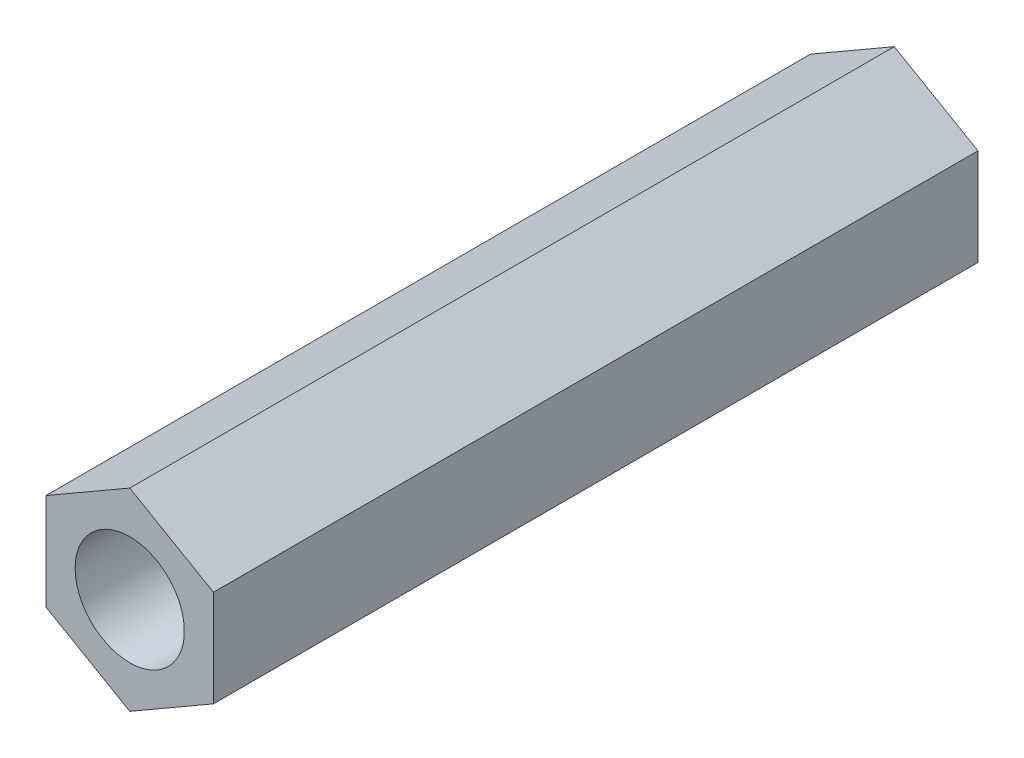
ISO-10303-21;
HEADER;
FILE_DESCRIPTION(('STEP AP214'),'2;1');
FILE_NAME('part.step','',(''),(''),'','','');
FILE_SCHEMA(('AUTOMOTIVE_DESIGN { 1 0 10303 214 1 1 1 1 }'));
ENDSEC;
DATA;
#1=APPLICATION_CONTEXT('core data for automotive mechanical design processes');
#2=APPLICATION_PROTOCOL_DEFINITION('international standard','automotive_design',2000,#1);
#3=PRODUCT_CONTEXT('',#1,'mechanical');
#4=PRODUCT('Part','Part','',(#3));
#5=PRODUCT_RELATED_PRODUCT_CATEGORY('part','',(#4));
#6=PRODUCT_DEFINITION_FORMATION('','',#4);
#7=PRODUCT_DEFINITION_CONTEXT('part definition',#1,'design');
#8=PRODUCT_DEFINITION('design','',#6,#7);
#9=PRODUCT_DEFINITION_SHAPE('','',#8);
#10=(LENGTH_UNIT() NAMED_UNIT(*) SI_UNIT(.MILLI.,.METRE.));
#11=(NAMED_UNIT(*) PLANE_ANGLE_UNIT() SI_UNIT($,.RADIAN.));
#12=(NAMED_UNIT(*) SI_UNIT($,.STERADIAN.) SOLID_ANGLE_UNIT());
#13=UNCERTAINTY_MEASURE_WITH_UNIT(LENGTH_MEASURE(1.E-05),#10,'distance_accuracy_value','');
#14=(GEOMETRIC_REPRESENTATION_CONTEXT(3) GLOBAL_UNCERTAINTY_ASSIGNED_CONTEXT((#13)) GLOBAL_UNIT_ASSIGNED_CONTEXT((#10,
#11,#12)) REPRESENTATION_CONTEXT('',''));
#15=CARTESIAN_POINT('',(0.,0.,0.));
#16=DIRECTION('',(0.,0.,1.));
#17=DIRECTION('',(1.,0.,0.));
#18=AXIS2_PLACEMENT_3D('',#15,#16,#17);
#19=CARTESIAN_POINT('',(0.,0.,21.));
#20=DIRECTION('',(0.,0.,1.));
#21=DIRECTION('',(1.,0.,0.));
#22=AXIS2_PLACEMENT_3D('',#19,#20,#21);
#23=PLANE('',#22);
#24=DIRECTION('',(0.866025403784438,0.5,0.));
#25=VECTOR('',#24,1.);
#26=CARTESIAN_POINT('',(0.,-2.65581123827228,21.));
#27=LINE('',#26,#25);
#28=CARTESIAN_POINT('',(0.,-2.65581123827228,21.));
#29=VERTEX_POINT('',#28);
#30=CARTESIAN_POINT('',(2.3,-1.32790561913614,21.));
#31=VERTEX_POINT('',#30);
#32=EDGE_CURVE('E140',#29,#31,#27,.T.);
#33=ORIENTED_EDGE('',*,*,#32,.T.);
#34=DIRECTION('',(0.,1.,0.));
#35=VECTOR('',#34,1.);
#36=CARTESIAN_POINT('',(2.3,-1.32790561913614,21.));
#37=LINE('',#36,#35);
#38=CARTESIAN_POINT('',(2.3,1.32790561913614,21.));
#39=VERTEX_POINT('',#38);
#40=EDGE_CURVE('E98',#31,#39,#37,.T.);
#41=ORIENTED_EDGE('',*,*,#40,.T.);
#42=DIRECTION('',(-0.866025403784438,0.5,0.));
#43=VECTOR('',#42,1.);
#44=CARTESIAN_POINT('',(2.3,1.32790561913614,21.));
#45=LINE('',#44,#43);
#46=CARTESIAN_POINT('',(0.,2.65581123827228,21.));
#47=VERTEX_POINT('',#46);
#48=EDGE_CURVE('E111',#39,#47,#45,.T.);
#49=ORIENTED_EDGE('',*,*,#48,.T.);
#50=DIRECTION('',(-0.866025403784439,-0.5,0.));
#51=VECTOR('',#50,1.);
#52=CARTESIAN_POINT('',(0.,2.65581123827228,21.));
#53=LINE('',#52,#51);
#54=CARTESIAN_POINT('',(-2.3,1.32790561913614,21.));
#55=VERTEX_POINT('',#54);
#56=EDGE_CURVE('E105',#47,#55,#53,.T.);
#57=ORIENTED_EDGE('',*,*,#56,.T.);
#58=DIRECTION('',(0.,-1.,0.));
#59=VECTOR('',#58,1.);
#60=CARTESIAN_POINT('',(-2.3,1.32790561913614,21.));
#61=LINE('',#60,#59);
#62=CARTESIAN_POINT('',(-2.3,-1.32790561913614,21.));
#63=VERTEX_POINT('',#62);
#64=EDGE_CURVE('E109',#55,#63,#61,.T.);
#65=ORIENTED_EDGE('',*,*,#64,.T.);
#66=DIRECTION('',(0.866025403784438,-0.5,0.));
#67=VECTOR('',#66,1.);
#68=CARTESIAN_POINT('',(-2.3,-1.32790561913614,21.));
#69=LINE('',#68,#67);
#70=EDGE_CURVE('E61',#63,#29,#69,.T.);
#71=ORIENTED_EDGE('',*,*,#70,.T.);
#72=EDGE_LOOP('',(#33,#41,#49,#57,#65,#71));
#73=FACE_BOUND('',#72,.T.);
#74=CARTESIAN_POINT('',(0.,0.,21.));
#75=DIRECTION('',(0.,0.,1.));
#76=DIRECTION('',(1.,0.,0.));
#77=AXIS2_PLACEMENT_3D('',#74,#75,#76);
#78=CIRCLE('',#77,1.5);
#79=CARTESIAN_POINT('',(-1.5,0.,21.));
#80=VERTEX_POINT('',#79);
#81=EDGE_CURVE('E133',#80,#80,#78,.T.);
#82=ORIENTED_EDGE('',*,*,#81,.F.);
#83=EDGE_LOOP('',(#82));
#84=FACE_BOUND('',#83,.T.);
#85=ADVANCED_FACE('F44',(#73,#84),#23,.T.);
#86=CARTESIAN_POINT('',(0.,0.,0.));
#87=DIRECTION('',(0.,0.,1.));
#88=DIRECTION('',(1.,0.,0.));
#89=AXIS2_PLACEMENT_3D('',#86,#87,#88);
#90=PLANE('',#89);
#91=DIRECTION('',(0.866025403784438,0.5,0.));
#92=VECTOR('',#91,1.);
#93=CARTESIAN_POINT('',(0.,-2.65581123827228,0.));
#94=LINE('',#93,#92);
#95=CARTESIAN_POINT('',(0.,-2.65581123827228,0.));
#96=VERTEX_POINT('',#95);
#97=CARTESIAN_POINT('',(2.3,-1.32790561913614,0.));
#98=VERTEX_POINT('',#97);
#99=EDGE_CURVE('E129',#96,#98,#94,.T.);
#100=ORIENTED_EDGE('',*,*,#99,.F.);
#101=DIRECTION('',(0.866025403784438,-0.5,0.));
#102=VECTOR('',#101,1.);
#103=CARTESIAN_POINT('',(-2.3,-1.32790561913614,0.));
#104=LINE('',#103,#102);
#105=CARTESIAN_POINT('',(-2.3,-1.32790561913614,0.));
#106=VERTEX_POINT('',#105);
#107=EDGE_CURVE('E90',#106,#96,#104,.T.);
#108=ORIENTED_EDGE('',*,*,#107,.F.);
#109=DIRECTION('',(0.,-1.,0.));
#110=VECTOR('',#109,1.);
#111=CARTESIAN_POINT('',(-2.3,1.32790561913614,0.));
#112=LINE('',#111,#110);
#113=CARTESIAN_POINT('',(-2.3,1.32790561913614,0.));
#114=VERTEX_POINT('',#113);
#115=EDGE_CURVE('E84',#114,#106,#112,.T.);
#116=ORIENTED_EDGE('',*,*,#115,.F.);
#117=DIRECTION('',(-0.866025403784439,-0.5,0.));
#118=VECTOR('',#117,1.);
#119=CARTESIAN_POINT('',(0.,2.65581123827228,0.));
#120=LINE('',#119,#118);
#121=CARTESIAN_POINT('',(0.,2.65581123827228,0.));
#122=VERTEX_POINT('',#121);
#123=EDGE_CURVE('E119',#122,#114,#120,.T.);
#124=ORIENTED_EDGE('',*,*,#123,.F.);
#125=DIRECTION('',(-0.866025403784438,0.5,0.));
#126=VECTOR('',#125,1.);
#127=CARTESIAN_POINT('',(2.3,1.32790561913614,0.));
#128=LINE('',#127,#126);
#129=CARTESIAN_POINT('',(2.3,1.32790561913614,0.));
#130=VERTEX_POINT('',#129);
#131=EDGE_CURVE('E135',#130,#122,#128,.T.);
#132=ORIENTED_EDGE('',*,*,#131,.F.);
#133=DIRECTION('',(0.,1.,0.));
#134=VECTOR('',#133,1.);
#135=CARTESIAN_POINT('',(2.3,-1.32790561913614,0.));
#136=LINE('',#135,#134);
#137=EDGE_CURVE('E132',#98,#130,#136,.T.);
#138=ORIENTED_EDGE('',*,*,#137,.F.);
#139=EDGE_LOOP('',(#100,#108,#116,#124,#132,#138));
#140=FACE_BOUND('',#139,.T.);
#141=CARTESIAN_POINT('',(0.,0.,0.));
#142=DIRECTION('',(0.,0.,1.));
#143=DIRECTION('',(1.,0.,0.));
#144=AXIS2_PLACEMENT_3D('',#141,#142,#143);
#145=CIRCLE('',#144,1.5);
#146=CARTESIAN_POINT('',(-1.5,0.,0.));
#147=VERTEX_POINT('',#146);
#148=EDGE_CURVE('E233',#147,#147,#145,.T.);
#149=ORIENTED_EDGE('',*,*,#148,.T.);
#150=EDGE_LOOP('',(#149));
#151=FACE_BOUND('',#150,.T.);
#152=ADVANCED_FACE('F149',(#140,#151),#90,.F.);
#153=CARTESIAN_POINT('',(0.,-2.65581123827228,21.));
#154=DIRECTION('',(-0.5,0.866025403784439,0.));
#155=DIRECTION('',(-0.866025403784439,-0.5,0.));
#156=AXIS2_PLACEMENT_3D('',#153,#154,#155);
#157=PLANE('',#156);
#158=ORIENTED_EDGE('',*,*,#99,.T.);
#159=DIRECTION('',(0.,0.,-1.));
#160=VECTOR('',#159,1.);
#161=CARTESIAN_POINT('',(2.3,-1.32790561913614,21.));
#162=LINE('',#161,#160);
#163=EDGE_CURVE('E11',#31,#98,#162,.T.);
#164=ORIENTED_EDGE('',*,*,#163,.F.);
#165=ORIENTED_EDGE('',*,*,#32,.F.);
#166=DIRECTION('',(0.,0.,-1.));
#167=VECTOR('',#166,1.);
#168=CARTESIAN_POINT('',(0.,-2.65581123827228,21.));
#169=LINE('',#168,#167);
#170=EDGE_CURVE('E125',#29,#96,#169,.T.);
#171=ORIENTED_EDGE('',*,*,#170,.T.);
#172=EDGE_LOOP('',(#158,#164,#165,#171));
#173=FACE_BOUND('',#172,.T.);
#174=ADVANCED_FACE('F46',(#173),#157,.F.);
#175=CARTESIAN_POINT('',(2.3,-1.32790561913614,21.));
#176=DIRECTION('',(-1.,0.,0.));
#177=DIRECTION('',(0.,-1.,0.));
#178=AXIS2_PLACEMENT_3D('',#175,#176,#177);
#179=PLANE('',#178);
#180=ORIENTED_EDGE('',*,*,#137,.T.);
#181=DIRECTION('',(0.,0.,-1.));
#182=VECTOR('',#181,1.);
#183=CARTESIAN_POINT('',(2.3,1.32790561913614,21.));
#184=LINE('',#183,#182);
#185=EDGE_CURVE('E53',#39,#130,#184,.T.);
#186=ORIENTED_EDGE('',*,*,#185,.F.);
#187=ORIENTED_EDGE('',*,*,#40,.F.);
#188=ORIENTED_EDGE('',*,*,#163,.T.);
#189=EDGE_LOOP('',(#180,#186,#187,#188));
#190=FACE_BOUND('',#189,.T.);
#191=ADVANCED_FACE('F174',(#190),#179,.F.);
#192=CARTESIAN_POINT('',(2.3,1.32790561913614,21.));
#193=DIRECTION('',(-0.5,-0.866025403784439,0.));
#194=DIRECTION('',(0.866025403784438,-0.5,0.));
#195=AXIS2_PLACEMENT_3D('',#192,#193,#194);
#196=PLANE('',#195);
#197=ORIENTED_EDGE('',*,*,#131,.T.);
#198=DIRECTION('',(0.,0.,-1.));
#199=VECTOR('',#198,1.);
#200=CARTESIAN_POINT('',(0.,2.65581123827228,21.));
#201=LINE('',#200,#199);
#202=EDGE_CURVE('E120',#47,#122,#201,.T.);
#203=ORIENTED_EDGE('',*,*,#202,.F.);
#204=ORIENTED_EDGE('',*,*,#48,.F.);
#205=ORIENTED_EDGE('',*,*,#185,.T.);
#206=EDGE_LOOP('',(#197,#203,#204,#205));
#207=FACE_BOUND('',#206,.T.);
#208=ADVANCED_FACE('F146',(#207),#196,.F.);
#209=CARTESIAN_POINT('',(0.,2.65581123827228,21.));
#210=DIRECTION('',(0.5,-0.866025403784439,0.));
#211=DIRECTION('',(0.866025403784439,0.5,0.));
#212=AXIS2_PLACEMENT_3D('',#209,#210,#211);
#213=PLANE('',#212);
#214=ORIENTED_EDGE('',*,*,#123,.T.);
#215=DIRECTION('',(0.,0.,-1.));
#216=VECTOR('',#215,1.);
#217=CARTESIAN_POINT('',(-2.3,1.32790561913614,21.));
#218=LINE('',#217,#216);
#219=EDGE_CURVE('E116',#55,#114,#218,.T.);
#220=ORIENTED_EDGE('',*,*,#219,.F.);
#221=ORIENTED_EDGE('',*,*,#56,.F.);
#222=ORIENTED_EDGE('',*,*,#202,.T.);
#223=EDGE_LOOP('',(#214,#220,#221,#222));
#224=FACE_BOUND('',#223,.T.);
#225=ADVANCED_FACE('F117',(#224),#213,.F.);
#226=CARTESIAN_POINT('',(-2.3,1.32790561913614,21.));
#227=DIRECTION('',(1.,0.,0.));
#228=DIRECTION('',(0.,1.,0.));
#229=AXIS2_PLACEMENT_3D('',#226,#227,#228);
#230=PLANE('',#229);
#231=ORIENTED_EDGE('',*,*,#115,.T.);
#232=DIRECTION('',(0.,0.,-1.));
#233=VECTOR('',#232,1.);
#234=CARTESIAN_POINT('',(-2.3,-1.32790561913614,21.));
#235=LINE('',#234,#233);
#236=EDGE_CURVE('E121',#63,#106,#235,.T.);
#237=ORIENTED_EDGE('',*,*,#236,.F.);
#238=ORIENTED_EDGE('',*,*,#64,.F.);
#239=ORIENTED_EDGE('',*,*,#219,.T.);
#240=EDGE_LOOP('',(#231,#237,#238,#239));
#241=FACE_BOUND('',#240,.T.);
#242=ADVANCED_FACE('F123',(#241),#230,.F.);
#243=CARTESIAN_POINT('',(-2.3,-1.32790561913614,21.));
#244=DIRECTION('',(0.5,0.866025403784439,0.));
#245=DIRECTION('',(-0.866025403784438,0.5,0.));
#246=AXIS2_PLACEMENT_3D('',#243,#244,#245);
#247=PLANE('',#246);
#248=ORIENTED_EDGE('',*,*,#107,.T.);
#249=ORIENTED_EDGE('',*,*,#170,.F.);
#250=ORIENTED_EDGE('',*,*,#70,.F.);
#251=ORIENTED_EDGE('',*,*,#236,.T.);
#252=EDGE_LOOP('',(#248,#249,#250,#251));
#253=FACE_BOUND('',#252,.T.);
#254=ADVANCED_FACE('F154',(#253),#247,.F.);
#255=CARTESIAN_POINT('',(0.,0.,21.));
#256=DIRECTION('',(0.,0.,-1.));
#257=DIRECTION('',(-1.,0.,0.));
#258=AXIS2_PLACEMENT_3D('',#255,#256,#257);
#259=CYLINDRICAL_SURFACE('',#258,1.5);
#260=CARTESIAN_POINT('',(-1.5,0.,21.));
#261=CARTESIAN_POINT('',(-1.5,0.,20.78125));
#262=CARTESIAN_POINT('',(-1.5,0.,20.5625));
#263=CARTESIAN_POINT('',(-1.5,0.,20.125));
#264=CARTESIAN_POINT('',(-1.5,0.,19.90625));
#265=CARTESIAN_POINT('',(-1.5,0.,19.46875));
#266=CARTESIAN_POINT('',(-1.5,0.,19.25));
#267=CARTESIAN_POINT('',(-1.5,0.,18.8125));
#268=CARTESIAN_POINT('',(-1.5,0.,18.59375));
#269=CARTESIAN_POINT('',(-1.5,0.,18.15625));
#270=CARTESIAN_POINT('',(-1.5,0.,17.9375));
#271=CARTESIAN_POINT('',(-1.5,0.,17.5));
#272=CARTESIAN_POINT('',(-1.5,0.,17.28125));
#273=CARTESIAN_POINT('',(-1.5,0.,16.84375));
#274=CARTESIAN_POINT('',(-1.5,0.,16.625));
#275=CARTESIAN_POINT('',(-1.5,0.,16.1875));
#276=CARTESIAN_POINT('',(-1.5,0.,15.96875));
#277=CARTESIAN_POINT('',(-1.5,0.,15.53125));
#278=CARTESIAN_POINT('',(-1.5,0.,15.3125));
#279=CARTESIAN_POINT('',(-1.5,0.,14.875));
#280=CARTESIAN_POINT('',(-1.5,0.,14.65625));
#281=CARTESIAN_POINT('',(-1.5,0.,14.21875));
#282=CARTESIAN_POINT('',(-1.5,0.,14.));
#283=CARTESIAN_POINT('',(-1.5,0.,13.5625));
#284=CARTESIAN_POINT('',(-1.5,0.,13.34375));
#285=CARTESIAN_POINT('',(-1.5,0.,12.90625));
#286=CARTESIAN_POINT('',(-1.5,0.,12.6875));
#287=CARTESIAN_POINT('',(-1.5,0.,12.25));
#288=CARTESIAN_POINT('',(-1.5,0.,12.03125));
#289=CARTESIAN_POINT('',(-1.5,0.,11.59375));
#290=CARTESIAN_POINT('',(-1.5,0.,11.375));
#291=CARTESIAN_POINT('',(-1.5,0.,10.9375));
#292=CARTESIAN_POINT('',(-1.5,0.,10.71875));
#293=CARTESIAN_POINT('',(-1.5,0.,10.28125));
#294=CARTESIAN_POINT('',(-1.5,0.,10.0625));
#295=CARTESIAN_POINT('',(-1.5,0.,9.625));
#296=CARTESIAN_POINT('',(-1.5,0.,9.40625));
#297=CARTESIAN_POINT('',(-1.5,0.,8.96875));
#298=CARTESIAN_POINT('',(-1.5,0.,8.75));
#299=CARTESIAN_POINT('',(-1.5,0.,8.3125));
#300=CARTESIAN_POINT('',(-1.5,0.,8.09375));
#301=CARTESIAN_POINT('',(-1.5,0.,7.65625));
#302=CARTESIAN_POINT('',(-1.5,0.,7.4375));
#303=CARTESIAN_POINT('',(-1.5,0.,7.));
#304=CARTESIAN_POINT('',(-1.5,0.,6.78125));
#305=CARTESIAN_POINT('',(-1.5,0.,6.34375));
#306=CARTESIAN_POINT('',(-1.5,0.,6.125));
#307=CARTESIAN_POINT('',(-1.5,0.,5.6875));
#308=CARTESIAN_POINT('',(-1.5,0.,5.46875));
#309=CARTESIAN_POINT('',(-1.5,0.,5.03125));
#310=CARTESIAN_POINT('',(-1.5,0.,4.8125));
#311=CARTESIAN_POINT('',(-1.5,0.,4.375));
#312=CARTESIAN_POINT('',(-1.5,0.,4.15625));
#313=CARTESIAN_POINT('',(-1.5,0.,3.71875));
#314=CARTESIAN_POINT('',(-1.5,0.,3.5));
#315=CARTESIAN_POINT('',(-1.5,0.,3.0625));
#316=CARTESIAN_POINT('',(-1.5,0.,2.84375));
#317=CARTESIAN_POINT('',(-1.5,0.,2.40625));
#318=CARTESIAN_POINT('',(-1.5,0.,2.1875));
#319=CARTESIAN_POINT('',(-1.5,0.,1.75));
#320=CARTESIAN_POINT('',(-1.5,0.,1.53125));
#321=CARTESIAN_POINT('',(-1.5,0.,1.09375));
#322=CARTESIAN_POINT('',(-1.5,0.,0.875000000000001));
#323=CARTESIAN_POINT('',(-1.5,0.,0.4375));
#324=CARTESIAN_POINT('',(-1.5,0.,0.21875));
#325=CARTESIAN_POINT('',(-1.5,0.,0.));
#326=B_SPLINE_CURVE_WITH_KNOTS('',3,(#260,#261,#262,#263,#264,#265,#266,#267,#268,#269,#270,
#271,#272,#273,#274,#275,#276,#277,#278,#279,#280,#281,#282,#283,#284,#285,#286,#287,#288,#289,
#290,#291,#292,#293,#294,#295,#296,#297,#298,#299,#300,#301,#302,#303,#304,#305,#306,#307,#308,
#309,#310,#311,#312,#313,#314,#315,#316,#317,#318,#319,#320,#321,#322,#323,#324,#325),
.UNSPECIFIED.,.F.,.F.,(4,2,2,2,2,2,2,2,2,2,2,2,2,2,2,2,2,2,2,2,2,2,2,2,2,2,2,2,2,2,2,2,4),(0.,
0.656249999999997,1.3125,1.96875,2.625,3.28125,3.9375,4.59375,5.25,5.90625,6.5625,7.21875,7.875,
8.53125,9.1875,9.84375,10.5,11.15625,11.8125,12.46875,13.125,13.78125,14.4375,15.09375,15.75,
16.40625,17.0625,17.71875,18.375,19.03125,19.6875,20.34375,21.),.UNSPECIFIED.);
#327=EDGE_CURVE('BSEAM156',#80,#147,#326,.T.);
#328=ORIENTED_EDGE('',*,*,#81,.T.);
#329=ORIENTED_EDGE('',*,*,#148,.F.);
#330=ORIENTED_EDGE('',*,*,#327,.T.);
#331=ORIENTED_EDGE('',*,*,#327,.F.);
#332=EDGE_LOOP('',(#328,#330,#329,#331));
#333=FACE_BOUND('',#332,.T.);
#334=ADVANCED_FACE('F156',(#333),#259,.F.);
#335=CLOSED_SHELL('',(#85,#152,#174,#191,#208,#225,#242,#254,#334));
#336=MANIFOLD_SOLID_BREP('B2',#335);
#337=ADVANCED_BREP_SHAPE_REPRESENTATION('',(#18,#336),#14);
#338=SHAPE_DEFINITION_REPRESENTATION(#9,#337);
ENDSEC;
END-ISO-10303-21;
